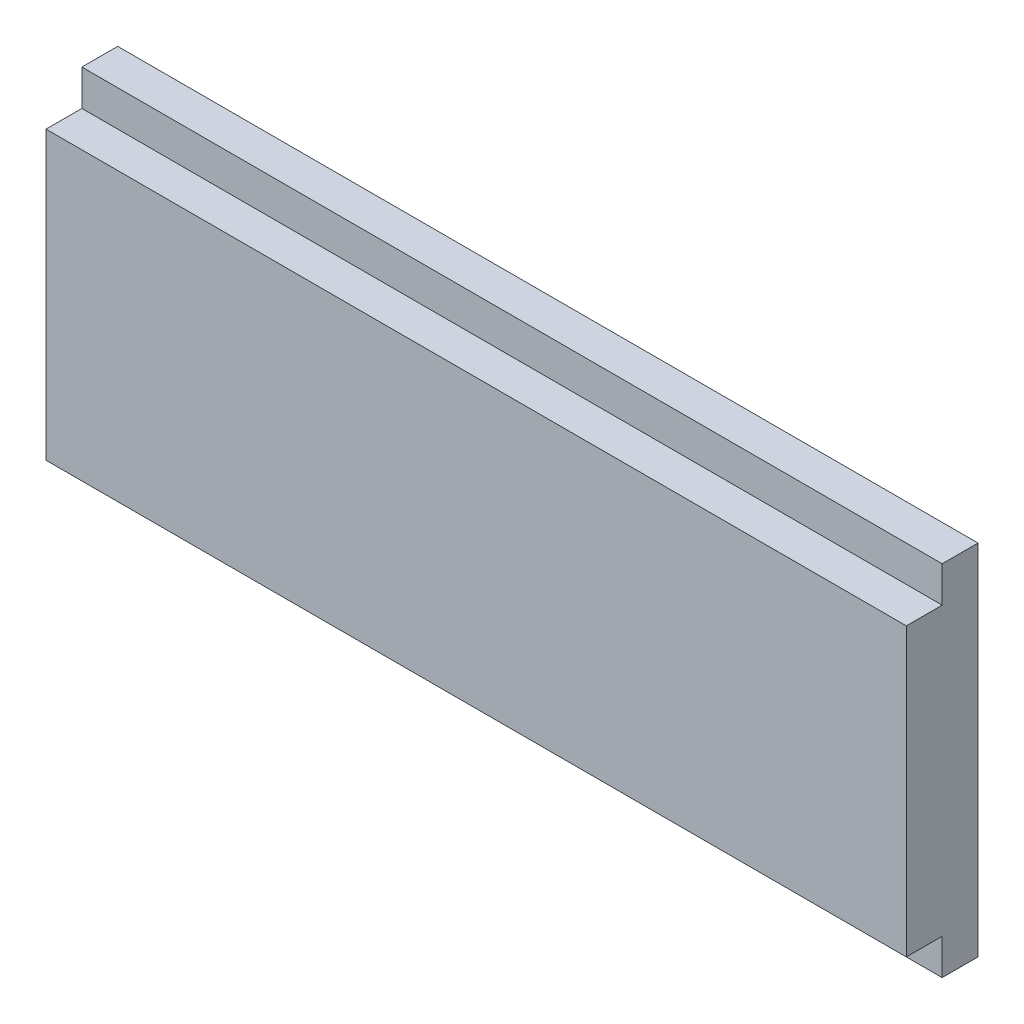
ISO-10303-21;
HEADER;
FILE_DESCRIPTION(('STEP AP214'),'2;1');
FILE_NAME('part.step','',(''),(''),'','','');
FILE_SCHEMA(('AUTOMOTIVE_DESIGN { 1 0 10303 214 1 1 1 1 }'));
ENDSEC;
DATA;
#1=APPLICATION_CONTEXT('core data for automotive mechanical design processes');
#2=APPLICATION_PROTOCOL_DEFINITION('international standard','automotive_design',2000,#1);
#3=PRODUCT_CONTEXT('',#1,'mechanical');
#4=PRODUCT('Part','Part','',(#3));
#5=PRODUCT_RELATED_PRODUCT_CATEGORY('part','',(#4));
#6=PRODUCT_DEFINITION_FORMATION('','',#4);
#7=PRODUCT_DEFINITION_CONTEXT('part definition',#1,'design');
#8=PRODUCT_DEFINITION('design','',#6,#7);
#9=PRODUCT_DEFINITION_SHAPE('','',#8);
#10=(LENGTH_UNIT() NAMED_UNIT(*) SI_UNIT(.MILLI.,.METRE.));
#11=(NAMED_UNIT(*) PLANE_ANGLE_UNIT() SI_UNIT($,.RADIAN.));
#12=(NAMED_UNIT(*) SI_UNIT($,.STERADIAN.) SOLID_ANGLE_UNIT());
#13=UNCERTAINTY_MEASURE_WITH_UNIT(LENGTH_MEASURE(1.E-05),#10,'distance_accuracy_value','');
#14=(GEOMETRIC_REPRESENTATION_CONTEXT(3) GLOBAL_UNCERTAINTY_ASSIGNED_CONTEXT((#13)) GLOBAL_UNIT_ASSIGNED_CONTEXT((#10,
#11,#12)) REPRESENTATION_CONTEXT('',''));
#15=CARTESIAN_POINT('',(0.,0.,0.));
#16=DIRECTION('',(0.,0.,1.));
#17=DIRECTION('',(1.,0.,0.));
#18=AXIS2_PLACEMENT_3D('',#15,#16,#17);
#19=CARTESIAN_POINT('',(0.,0.,2.5));
#20=DIRECTION('',(0.,0.,1.));
#21=DIRECTION('',(1.,0.,0.));
#22=AXIS2_PLACEMENT_3D('',#19,#20,#21);
#23=PLANE('',#22);
#24=DIRECTION('',(-1.,0.,0.));
#25=VECTOR('',#24,1.);
#26=CARTESIAN_POINT('',(-30.,10.,2.5));
#27=LINE('',#26,#25);
#28=CARTESIAN_POINT('',(30.,10.,2.5));
#29=VERTEX_POINT('',#28);
#30=CARTESIAN_POINT('',(-30.,10.,2.5));
#31=VERTEX_POINT('',#30);
#32=EDGE_CURVE('E59',#29,#31,#27,.T.);
#33=ORIENTED_EDGE('',*,*,#32,.F.);
#34=DIRECTION('',(0.,1.,0.));
#35=VECTOR('',#34,1.);
#36=CARTESIAN_POINT('',(30.,-12.5,2.5));
#37=LINE('',#36,#35);
#38=CARTESIAN_POINT('',(30.,12.5,2.5));
#39=VERTEX_POINT('',#38);
#40=EDGE_CURVE('E151',#29,#39,#37,.T.);
#41=ORIENTED_EDGE('',*,*,#40,.T.);
#42=DIRECTION('',(-1.,0.,0.));
#43=VECTOR('',#42,1.);
#44=CARTESIAN_POINT('',(30.,12.5,2.5));
#45=LINE('',#44,#43);
#46=CARTESIAN_POINT('',(-30.,12.5,2.5));
#47=VERTEX_POINT('',#46);
#48=EDGE_CURVE('E155',#39,#47,#45,.T.);
#49=ORIENTED_EDGE('',*,*,#48,.T.);
#50=DIRECTION('',(0.,-1.,0.));
#51=VECTOR('',#50,1.);
#52=CARTESIAN_POINT('',(-30.,-12.5,2.5));
#53=LINE('',#52,#51);
#54=EDGE_CURVE('E145',#47,#31,#53,.T.);
#55=ORIENTED_EDGE('',*,*,#54,.T.);
#56=EDGE_LOOP('',(#33,#41,#49,#55));
#57=FACE_BOUND('',#56,.T.);
#58=ADVANCED_FACE('F43',(#57),#23,.T.);
#59=CARTESIAN_POINT('',(-30.,-12.5,2.5));
#60=DIRECTION('',(1.,0.,0.));
#61=DIRECTION('',(0.,0.,-1.));
#62=AXIS2_PLACEMENT_3D('',#59,#60,#61);
#63=PLANE('',#62);
#64=DIRECTION('',(0.,-1.,0.));
#65=VECTOR('',#64,1.);
#66=CARTESIAN_POINT('',(-30.,-12.5,0.));
#67=LINE('',#66,#65);
#68=CARTESIAN_POINT('',(-30.,12.5,0.));
#69=VERTEX_POINT('',#68);
#70=CARTESIAN_POINT('',(-30.,-12.5,0.));
#71=VERTEX_POINT('',#70);
#72=EDGE_CURVE('E135',#69,#71,#67,.T.);
#73=ORIENTED_EDGE('',*,*,#72,.T.);
#74=DIRECTION('',(0.,0.,-1.));
#75=VECTOR('',#74,1.);
#76=CARTESIAN_POINT('',(-30.,-12.5,2.5));
#77=LINE('',#76,#75);
#78=CARTESIAN_POINT('',(-30.,-12.5,2.5));
#79=VERTEX_POINT('',#78);
#80=EDGE_CURVE('E11',#79,#71,#77,.T.);
#81=ORIENTED_EDGE('',*,*,#80,.F.);
#82=CARTESIAN_POINT('',(-30.,-10.,2.5));
#83=VERTEX_POINT('',#82);
#84=EDGE_CURVE('E133',#83,#79,#53,.T.);
#85=ORIENTED_EDGE('',*,*,#84,.F.);
#86=DIRECTION('',(0.,0.,-1.));
#87=VECTOR('',#86,1.);
#88=CARTESIAN_POINT('',(-30.,-10.,5.));
#89=LINE('',#88,#87);
#90=CARTESIAN_POINT('',(-30.,-10.,5.));
#91=VERTEX_POINT('',#90);
#92=EDGE_CURVE('E113',#91,#83,#89,.T.);
#93=ORIENTED_EDGE('',*,*,#92,.F.);
#94=DIRECTION('',(0.,-1.,0.));
#95=VECTOR('',#94,1.);
#96=CARTESIAN_POINT('',(-30.,10.,5.));
#97=LINE('',#96,#95);
#98=CARTESIAN_POINT('',(-30.,10.,5.));
#99=VERTEX_POINT('',#98);
#100=EDGE_CURVE('E120',#99,#91,#97,.T.);
#101=ORIENTED_EDGE('',*,*,#100,.F.);
#102=DIRECTION('',(0.,0.,-1.));
#103=VECTOR('',#102,1.);
#104=CARTESIAN_POINT('',(-30.,10.,5.));
#105=LINE('',#104,#103);
#106=EDGE_CURVE('E192',#99,#31,#105,.T.);
#107=ORIENTED_EDGE('',*,*,#106,.T.);
#108=ORIENTED_EDGE('',*,*,#54,.F.);
#109=DIRECTION('',(0.,0.,-1.));
#110=VECTOR('',#109,1.);
#111=CARTESIAN_POINT('',(-30.,12.5,2.5));
#112=LINE('',#111,#110);
#113=EDGE_CURVE('E157',#47,#69,#112,.T.);
#114=ORIENTED_EDGE('',*,*,#113,.T.);
#115=EDGE_LOOP('',(#73,#81,#85,#93,#101,#107,#108,#114));
#116=FACE_BOUND('',#115,.T.);
#117=ADVANCED_FACE('F45',(#116),#63,.F.);
#118=CARTESIAN_POINT('',(30.,-12.5,2.5));
#119=DIRECTION('',(0.,1.,0.));
#120=DIRECTION('',(-1.,0.,0.));
#121=AXIS2_PLACEMENT_3D('',#118,#119,#120);
#122=PLANE('',#121);
#123=DIRECTION('',(1.,0.,0.));
#124=VECTOR('',#123,1.);
#125=CARTESIAN_POINT('',(30.,-12.5,0.));
#126=LINE('',#125,#124);
#127=CARTESIAN_POINT('',(30.,-12.5,0.));
#128=VERTEX_POINT('',#127);
#129=EDGE_CURVE('E139',#71,#128,#126,.T.);
#130=ORIENTED_EDGE('',*,*,#129,.T.);
#131=DIRECTION('',(0.,0.,-1.));
#132=VECTOR('',#131,1.);
#133=CARTESIAN_POINT('',(30.,-12.5,2.5));
#134=LINE('',#133,#132);
#135=CARTESIAN_POINT('',(30.,-12.5,2.5));
#136=VERTEX_POINT('',#135);
#137=EDGE_CURVE('E52',#136,#128,#134,.T.);
#138=ORIENTED_EDGE('',*,*,#137,.F.);
#139=DIRECTION('',(1.,0.,0.));
#140=VECTOR('',#139,1.);
#141=CARTESIAN_POINT('',(30.,-12.5,2.5));
#142=LINE('',#141,#140);
#143=EDGE_CURVE('E148',#79,#136,#142,.T.);
#144=ORIENTED_EDGE('',*,*,#143,.F.);
#145=ORIENTED_EDGE('',*,*,#80,.T.);
#146=EDGE_LOOP('',(#130,#138,#144,#145));
#147=FACE_BOUND('',#146,.T.);
#148=ADVANCED_FACE('F211',(#147),#122,.F.);
#149=CARTESIAN_POINT('',(30.,-12.5,2.5));
#150=DIRECTION('',(-1.,0.,0.));
#151=DIRECTION('',(0.,0.,1.));
#152=AXIS2_PLACEMENT_3D('',#149,#150,#151);
#153=PLANE('',#152);
#154=DIRECTION('',(0.,1.,0.));
#155=VECTOR('',#154,1.);
#156=CARTESIAN_POINT('',(30.,-12.5,0.));
#157=LINE('',#156,#155);
#158=CARTESIAN_POINT('',(30.,12.5,0.));
#159=VERTEX_POINT('',#158);
#160=EDGE_CURVE('E161',#128,#159,#157,.T.);
#161=ORIENTED_EDGE('',*,*,#160,.T.);
#162=DIRECTION('',(0.,0.,-1.));
#163=VECTOR('',#162,1.);
#164=CARTESIAN_POINT('',(30.,12.5,2.5));
#165=LINE('',#164,#163);
#166=EDGE_CURVE('E170',#39,#159,#165,.T.);
#167=ORIENTED_EDGE('',*,*,#166,.F.);
#168=ORIENTED_EDGE('',*,*,#40,.F.);
#169=DIRECTION('',(0.,0.,-1.));
#170=VECTOR('',#169,1.);
#171=CARTESIAN_POINT('',(30.,10.,5.));
#172=LINE('',#171,#170);
#173=CARTESIAN_POINT('',(30.,10.,5.));
#174=VERTEX_POINT('',#173);
#175=EDGE_CURVE('E141',#174,#29,#172,.T.);
#176=ORIENTED_EDGE('',*,*,#175,.F.);
#177=DIRECTION('',(0.,1.,0.));
#178=VECTOR('',#177,1.);
#179=CARTESIAN_POINT('',(30.,10.,5.));
#180=LINE('',#179,#178);
#181=CARTESIAN_POINT('',(30.,-10.,5.));
#182=VERTEX_POINT('',#181);
#183=EDGE_CURVE('E119',#182,#174,#180,.T.);
#184=ORIENTED_EDGE('',*,*,#183,.F.);
#185=DIRECTION('',(0.,0.,-1.));
#186=VECTOR('',#185,1.);
#187=CARTESIAN_POINT('',(30.,-10.,5.));
#188=LINE('',#187,#186);
#189=CARTESIAN_POINT('',(30.,-10.,2.5));
#190=VERTEX_POINT('',#189);
#191=EDGE_CURVE('E115',#182,#190,#188,.T.);
#192=ORIENTED_EDGE('',*,*,#191,.T.);
#193=EDGE_CURVE('E152',#136,#190,#37,.T.);
#194=ORIENTED_EDGE('',*,*,#193,.F.);
#195=ORIENTED_EDGE('',*,*,#137,.T.);
#196=EDGE_LOOP('',(#161,#167,#168,#176,#184,#192,#194,#195));
#197=FACE_BOUND('',#196,.T.);
#198=ADVANCED_FACE('F179',(#197),#153,.F.);
#199=CARTESIAN_POINT('',(30.,12.5,2.5));
#200=DIRECTION('',(0.,-1.,0.));
#201=DIRECTION('',(1.,0.,0.));
#202=AXIS2_PLACEMENT_3D('',#199,#200,#201);
#203=PLANE('',#202);
#204=DIRECTION('',(-1.,0.,0.));
#205=VECTOR('',#204,1.);
#206=CARTESIAN_POINT('',(30.,12.5,0.));
#207=LINE('',#206,#205);
#208=EDGE_CURVE('E164',#159,#69,#207,.T.);
#209=ORIENTED_EDGE('',*,*,#208,.T.);
#210=ORIENTED_EDGE('',*,*,#113,.F.);
#211=ORIENTED_EDGE('',*,*,#48,.F.);
#212=ORIENTED_EDGE('',*,*,#166,.T.);
#213=EDGE_LOOP('',(#209,#210,#211,#212));
#214=FACE_BOUND('',#213,.T.);
#215=ADVANCED_FACE('F189',(#214),#203,.F.);
#216=DIRECTION('',(1.,0.,0.));
#217=VECTOR('',#216,1.);
#218=CARTESIAN_POINT('',(30.,-10.,2.5));
#219=LINE('',#218,#217);
#220=EDGE_CURVE('E67',#83,#190,#219,.T.);
#221=ORIENTED_EDGE('',*,*,#220,.F.);
#222=ORIENTED_EDGE('',*,*,#84,.T.);
#223=ORIENTED_EDGE('',*,*,#143,.T.);
#224=ORIENTED_EDGE('',*,*,#193,.T.);
#225=EDGE_LOOP('',(#221,#222,#223,#224));
#226=FACE_BOUND('',#225,.T.);
#227=ADVANCED_FACE('F210',(#226),#23,.T.);
#228=CARTESIAN_POINT('',(0.,0.,0.));
#229=DIRECTION('',(0.,0.,1.));
#230=DIRECTION('',(1.,0.,0.));
#231=AXIS2_PLACEMENT_3D('',#228,#229,#230);
#232=PLANE('',#231);
#233=ORIENTED_EDGE('',*,*,#72,.F.);
#234=ORIENTED_EDGE('',*,*,#208,.F.);
#235=ORIENTED_EDGE('',*,*,#160,.F.);
#236=ORIENTED_EDGE('',*,*,#129,.F.);
#237=EDGE_LOOP('',(#233,#234,#235,#236));
#238=FACE_BOUND('',#237,.T.);
#239=ADVANCED_FACE('F186',(#238),#232,.F.);
#240=CARTESIAN_POINT('',(30.,-10.,5.));
#241=DIRECTION('',(0.,1.,0.));
#242=DIRECTION('',(-1.,0.,0.));
#243=AXIS2_PLACEMENT_3D('',#240,#241,#242);
#244=PLANE('',#243);
#245=ORIENTED_EDGE('',*,*,#220,.T.);
#246=ORIENTED_EDGE('',*,*,#191,.F.);
#247=DIRECTION('',(1.,0.,0.));
#248=VECTOR('',#247,1.);
#249=CARTESIAN_POINT('',(30.,-10.,5.));
#250=LINE('',#249,#248);
#251=EDGE_CURVE('E109',#91,#182,#250,.T.);
#252=ORIENTED_EDGE('',*,*,#251,.F.);
#253=ORIENTED_EDGE('',*,*,#92,.T.);
#254=EDGE_LOOP('',(#245,#246,#252,#253));
#255=FACE_BOUND('',#254,.T.);
#256=ADVANCED_FACE('F111',(#255),#244,.F.);
#257=CARTESIAN_POINT('',(-30.,10.,5.));
#258=DIRECTION('',(0.,-1.,0.));
#259=DIRECTION('',(1.,0.,0.));
#260=AXIS2_PLACEMENT_3D('',#257,#258,#259);
#261=PLANE('',#260);
#262=ORIENTED_EDGE('',*,*,#32,.T.);
#263=ORIENTED_EDGE('',*,*,#106,.F.);
#264=DIRECTION('',(-1.,0.,0.));
#265=VECTOR('',#264,1.);
#266=CARTESIAN_POINT('',(-30.,10.,5.));
#267=LINE('',#266,#265);
#268=EDGE_CURVE('E125',#174,#99,#267,.T.);
#269=ORIENTED_EDGE('',*,*,#268,.F.);
#270=ORIENTED_EDGE('',*,*,#175,.T.);
#271=EDGE_LOOP('',(#262,#263,#269,#270));
#272=FACE_BOUND('',#271,.T.);
#273=ADVANCED_FACE('F195',(#272),#261,.F.);
#274=CARTESIAN_POINT('',(0.,0.,5.));
#275=DIRECTION('',(0.,0.,-1.));
#276=DIRECTION('',(-1.,0.,0.));
#277=AXIS2_PLACEMENT_3D('',#274,#275,#276);
#278=PLANE('',#277);
#279=ORIENTED_EDGE('',*,*,#100,.T.);
#280=ORIENTED_EDGE('',*,*,#251,.T.);
#281=ORIENTED_EDGE('',*,*,#183,.T.);
#282=ORIENTED_EDGE('',*,*,#268,.T.);
#283=EDGE_LOOP('',(#279,#280,#281,#282));
#284=FACE_BOUND('',#283,.T.);
#285=ADVANCED_FACE('F123',(#284),#278,.F.);
#286=CLOSED_SHELL('',(#58,#117,#148,#198,#215,#227,#239,#256,#273,#285));
#287=MANIFOLD_SOLID_BREP('B2',#286);
#288=ADVANCED_BREP_SHAPE_REPRESENTATION('',(#18,#287),#14);
#289=SHAPE_DEFINITION_REPRESENTATION(#9,#288);
ENDSEC;
END-ISO-10303-21;
